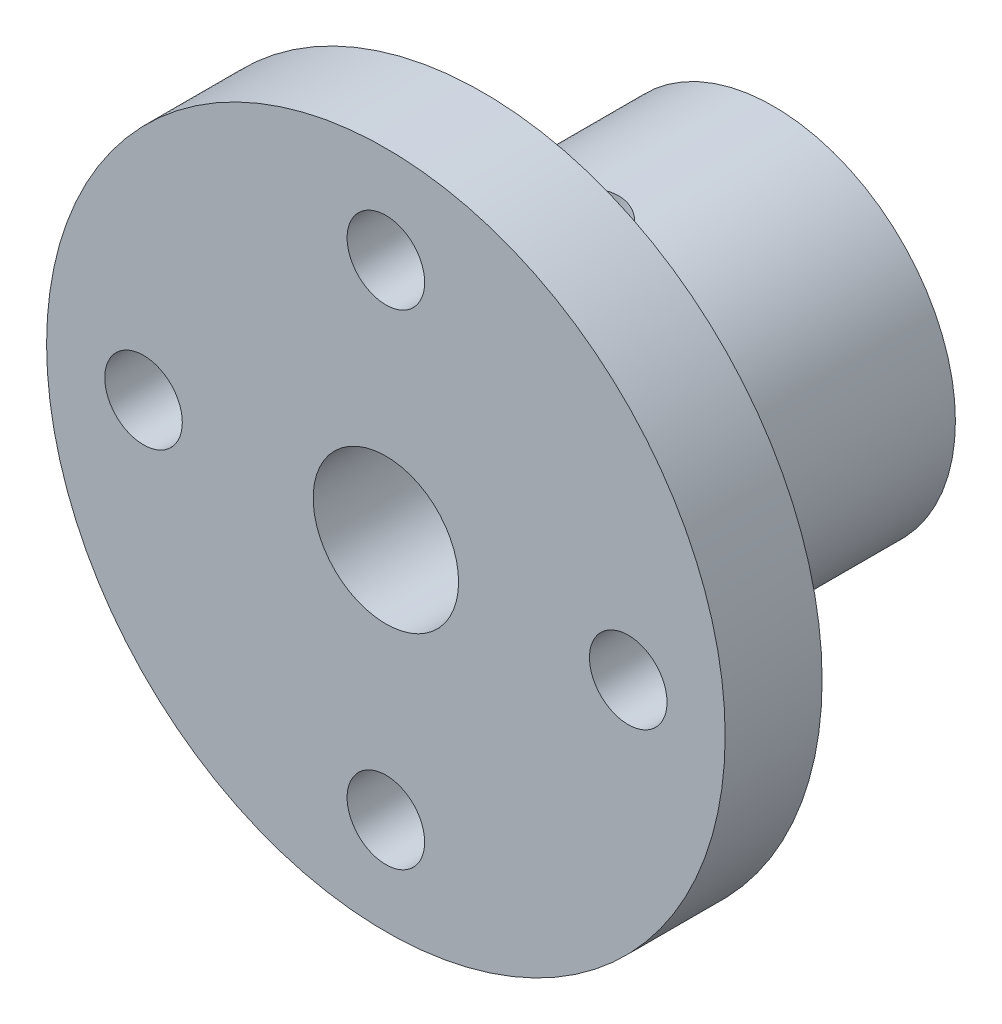
ISO-10303-21;
HEADER;
FILE_DESCRIPTION(('STEP AP214'),'2;1');
FILE_NAME('part.step','',(''),(''),'','','');
FILE_SCHEMA(('AUTOMOTIVE_DESIGN { 1 0 10303 214 1 1 1 1 }'));
ENDSEC;
DATA;
#1=APPLICATION_CONTEXT('core data for automotive mechanical design processes');
#2=APPLICATION_PROTOCOL_DEFINITION('international standard','automotive_design',2000,#1);
#3=PRODUCT_CONTEXT('',#1,'mechanical');
#4=PRODUCT('Part','Part','',(#3));
#5=PRODUCT_RELATED_PRODUCT_CATEGORY('part','',(#4));
#6=PRODUCT_DEFINITION_FORMATION('','',#4);
#7=PRODUCT_DEFINITION_CONTEXT('part definition',#1,'design');
#8=PRODUCT_DEFINITION('design','',#6,#7);
#9=PRODUCT_DEFINITION_SHAPE('','',#8);
#10=(LENGTH_UNIT() NAMED_UNIT(*) SI_UNIT(.MILLI.,.METRE.));
#11=(NAMED_UNIT(*) PLANE_ANGLE_UNIT() SI_UNIT($,.RADIAN.));
#12=(NAMED_UNIT(*) SI_UNIT($,.STERADIAN.) SOLID_ANGLE_UNIT());
#13=UNCERTAINTY_MEASURE_WITH_UNIT(LENGTH_MEASURE(1.E-05),#10,'distance_accuracy_value','');
#14=(GEOMETRIC_REPRESENTATION_CONTEXT(3) GLOBAL_UNCERTAINTY_ASSIGNED_CONTEXT((#13)) GLOBAL_UNIT_ASSIGNED_CONTEXT((#10,
#11,#12)) REPRESENTATION_CONTEXT('',''));
#15=CARTESIAN_POINT('',(0.,0.,0.));
#16=DIRECTION('',(0.,0.,1.));
#17=DIRECTION('',(1.,0.,0.));
#18=AXIS2_PLACEMENT_3D('',#15,#16,#17);
#19=CARTESIAN_POINT('',(0.,0.,-16.));
#20=DIRECTION('',(0.,0.,1.));
#21=DIRECTION('',(1.,0.,0.));
#22=AXIS2_PLACEMENT_3D('',#19,#20,#21);
#23=CYLINDRICAL_SURFACE('',#22,7.5);
#24=CARTESIAN_POINT('',(0.,7.5,-6.4));
#25=CARTESIAN_POINT('',(0.0887944293338555,7.4999983570598,-6.40000310580464));
#26=CARTESIAN_POINT('',(0.177626889700681,7.49840703800838,-6.40741663447956));
#27=CARTESIAN_POINT('',(0.352772204992273,7.49221258982039,-6.43684623857203));
#28=CARTESIAN_POINT('',(0.439083150622767,7.48760723719598,-6.45887309457672));
#29=CARTESIAN_POINT('',(0.60662858018066,7.47589793294748,-6.51681095195386));
#30=CARTESIAN_POINT('',(0.687868139445261,7.46879652810656,-6.55270780512142));
#31=CARTESIAN_POINT('',(0.843167757727071,7.45286320133509,-6.63732260760266));
#32=CARTESIAN_POINT('',(0.917228073407919,7.4440313413038,-6.68604009833691));
#33=CARTESIAN_POINT('',(1.05720419368928,7.42545480782523,-6.79570283046542));
#34=CARTESIAN_POINT('',(1.12299434543086,7.41569927510424,-6.85680663310305));
#35=CARTESIAN_POINT('',(1.24347351522622,7.39645215099328,-6.989166936086));
#36=CARTESIAN_POINT('',(1.29816158128342,7.38696058229821,-7.0604243062022));
#37=CARTESIAN_POINT('',(1.39543277767187,7.36920930951561,-7.21199059505989));
#38=CARTESIAN_POINT('',(1.43788322502763,7.36096353805546,-7.29238644331646));
#39=CARTESIAN_POINT('',(1.50862340101052,7.34679287525929,-7.45937531689855));
#40=CARTESIAN_POINT('',(1.53691473453874,7.34086772090353,-7.54596763859659));
#41=CARTESIAN_POINT('',(1.5781204953587,7.33211955105285,-7.72153161911032));
#42=CARTESIAN_POINT('',(1.59125680705956,7.32925182047022,-7.81044892540795));
#43=CARTESIAN_POINT('',(1.60246934089929,7.32680881403605,-7.98926804415069));
#44=CARTESIAN_POINT('',(1.60054732105774,7.32723315384412,-8.07916974044716));
#45=CARTESIAN_POINT('',(1.58187655808685,7.33128581769295,-8.25576395551687));
#46=CARTESIAN_POINT('',(1.56538455643806,7.33485865843677,-8.3424850841123));
#47=CARTESIAN_POINT('',(1.51844828834832,7.34471814062502,-8.51190065169833));
#48=CARTESIAN_POINT('',(1.48800327344863,7.35100492764819,-8.59459487441691));
#49=CARTESIAN_POINT('',(1.41378668233803,7.36563922179753,-8.75433637344018));
#50=CARTESIAN_POINT('',(1.36991548636568,7.37400204199821,-8.8313359047914));
#51=CARTESIAN_POINT('',(1.27016199217251,7.39183660364213,-8.97697571322876));
#52=CARTESIAN_POINT('',(1.21427813244002,7.40130848917848,-9.04561490174509));
#53=CARTESIAN_POINT('',(1.09072196751541,7.4205326849195,-9.17406475391846));
#54=CARTESIAN_POINT('',(1.02283110172082,7.43028675890513,-9.23366511786382));
#55=CARTESIAN_POINT('',(0.877908758701803,7.44879883076769,-9.34066741368745));
#56=CARTESIAN_POINT('',(0.800877131200498,7.45755681226393,-9.38806914497592));
#57=CARTESIAN_POINT('',(0.639610081827262,7.4731161994162,-9.46937667500744));
#58=CARTESIAN_POINT('',(0.555360898326548,7.47991375438739,-9.50325596228198));
#59=CARTESIAN_POINT('',(0.382188547319413,7.49075760800742,-9.55631934120427));
#60=CARTESIAN_POINT('',(0.293266027489785,7.49480428682212,-9.57550546346589));
#61=CARTESIAN_POINT('',(0.115076046551737,7.49963667143352,-9.59833443018385));
#62=CARTESIAN_POINT('',(0.0258469966592105,7.50048267119555,-9.60226469968599));
#63=CARTESIAN_POINT('',(-0.151992686527999,7.49898689492793,-9.5952479687875));
#64=CARTESIAN_POINT('',(-0.240603359252846,7.49664532405204,-9.58430192583435));
#65=CARTESIAN_POINT('',(-0.413746062380252,7.48907546339841,-9.54808177478367));
#66=CARTESIAN_POINT('',(-0.4983108633353,7.48387736587364,-9.52295745147483));
#67=CARTESIAN_POINT('',(-0.662026395792983,7.47117587533623,-9.45925941611984));
#68=CARTESIAN_POINT('',(-0.741176681186478,7.46367229265062,-9.4206845974621));
#69=CARTESIAN_POINT('',(-0.893011950773004,7.44704294085318,-9.33057492538175));
#70=CARTESIAN_POINT('',(-0.96559365973848,7.43789638159133,-9.27886997348518));
#71=CARTESIAN_POINT('',(-1.10115356003048,7.41903990869546,-9.16419284396975));
#72=CARTESIAN_POINT('',(-1.16413056725132,7.40932992580373,-9.1012192791882));
#73=CARTESIAN_POINT('',(-1.27982177561402,7.39023419815026,-8.96447656037231));
#74=CARTESIAN_POINT('',(-1.33233743532724,7.38085708289827,-8.89053800659191));
#75=CARTESIAN_POINT('',(-1.42420609305472,7.36368318738415,-8.73472128848835));
#76=CARTESIAN_POINT('',(-1.46355965021716,7.35588633999514,-8.65284346162946));
#77=CARTESIAN_POINT('',(-1.52772807228231,7.3428278116798,-8.4839054249434));
#78=CARTESIAN_POINT('',(-1.55262307368944,7.33755218632522,-8.39687678422949));
#79=CARTESIAN_POINT('',(-1.58740514879098,7.33010689029808,-8.21974527412033));
#80=CARTESIAN_POINT('',(-1.59729448874882,7.32793675061545,-8.12964287104898));
#81=CARTESIAN_POINT('',(-1.60169174862619,7.32697666157729,-7.95092074272306));
#82=CARTESIAN_POINT('',(-1.59651412882043,7.32811760571581,-7.86230897944379));
#83=CARTESIAN_POINT('',(-1.57162478005708,7.33349539816058,-7.68725139744787));
#84=CARTESIAN_POINT('',(-1.55191320540032,7.33773221359929,-7.60080555574663));
#85=CARTESIAN_POINT('',(-1.49866402761734,7.34879149338567,-7.4327687553766));
#86=CARTESIAN_POINT('',(-1.46517005919756,7.35560579203591,-7.35116339646566));
#87=CARTESIAN_POINT('',(-1.38534516691845,7.37105584436333,-7.19468291630875));
#88=CARTESIAN_POINT('',(-1.33901298148492,7.37969177702726,-7.1198084574469));
#89=CARTESIAN_POINT('',(-1.23377464987916,7.39801997202294,-6.97736032255051));
#90=CARTESIAN_POINT('',(-1.17464349733653,7.40772937703983,-6.90995505174662));
#91=CARTESIAN_POINT('',(-1.0459443480745,7.42699305436863,-6.78592046785692));
#92=CARTESIAN_POINT('',(-0.976373947694454,7.43654729038956,-6.72929364336272));
#93=CARTESIAN_POINT('',(-0.827748193968452,7.4545622712928,-6.62776396054319));
#94=CARTESIAN_POINT('',(-0.748587403501144,7.46300824065792,-6.58301269010891));
#95=CARTESIAN_POINT('',(-0.583706040029167,7.47770774713458,-6.50752100144343));
#96=CARTESIAN_POINT('',(-0.497991165498193,7.48396316300769,-6.47676857007093));
#97=CARTESIAN_POINT('',(-0.34346476310391,7.49243099511991,-6.43577023708618));
#98=CARTESIAN_POINT('',(-0.275502835649662,7.4952520823403,-6.42238148534867));
#99=CARTESIAN_POINT('',(-0.138368271279889,7.49903718747764,-6.4044953360015));
#100=CARTESIAN_POINT('',(-0.0691956833185953,7.5000012803097,-6.39999757970994));
#101=CARTESIAN_POINT('',(0.,7.5,-6.4));
#102=B_SPLINE_CURVE_WITH_KNOTS('',3,(#24,#25,#26,#27,#28,#29,#30,#31,#32,#33,#34,#35,#36,#37,
#38,#39,#40,#41,#42,#43,#44,#45,#46,#47,#48,#49,#50,#51,#52,#53,#54,#55,#56,#57,#58,#59,#60,#61,
#62,#63,#64,#65,#66,#67,#68,#69,#70,#71,#72,#73,#74,#75,#76,#77,#78,#79,#80,#81,#82,#83,#84,#85,
#86,#87,#88,#89,#90,#91,#92,#93,#94,#95,#96,#97,#98,#99,#100,#101),.UNSPECIFIED.,.T.,.F.,(4,2,2,
2,2,2,2,2,2,2,2,2,2,2,2,2,2,2,2,2,2,2,2,2,2,2,2,2,2,2,2,2,2,2,2,2,2,2,4),(0.,0.266130047854763,
0.532456644597193,0.798512286868045,1.0645584139285,1.33425388789939,1.60397247832158,
1.87651399120587,2.14902460517277,2.41749263134366,2.68592931506412,2.94972810159234,
3.21354104030559,3.47936093436643,3.74521540295248,4.01653060252532,4.28785026321978,
4.55969927797482,4.83151071607125,5.09817555204362,5.36482322613615,5.62870529395038,
5.89260907723843,6.16012360036749,6.42767107713311,6.69989324302713,6.97210384299803,
7.24279095265699,7.51343717712195,7.77847555890145,8.04351112692155,8.30771397733335,
8.57194279940304,8.84126112654219,9.11064156026671,9.38331104903345,9.65574610257701,
9.86314417471904,10.0705338798061),.UNSPECIFIED.);
#103=CARTESIAN_POINT('',(0.,7.5,-6.4));
#104=VERTEX_POINT('',#103);
#105=EDGE_CURVE('E103',#104,#104,#102,.T.);
#106=ORIENTED_EDGE('',*,*,#105,.F.);
#107=EDGE_LOOP('',(#106));
#108=FACE_BOUND('',#107,.T.);
#109=CARTESIAN_POINT('',(0.,0.,-16.));
#110=DIRECTION('',(0.,0.,1.));
#111=DIRECTION('',(1.,0.,0.));
#112=AXIS2_PLACEMENT_3D('',#109,#110,#111);
#113=CIRCLE('',#112,7.5);
#114=CARTESIAN_POINT('',(7.5,0.,-16.));
#115=VERTEX_POINT('',#114);
#116=EDGE_CURVE('E10',#115,#115,#113,.T.);
#117=ORIENTED_EDGE('',*,*,#116,.T.);
#118=EDGE_LOOP('',(#117));
#119=FACE_BOUND('',#118,.T.);
#120=CARTESIAN_POINT('',(0.,0.,-4.));
#121=DIRECTION('',(0.,0.,1.));
#122=DIRECTION('',(1.,0.,0.));
#123=AXIS2_PLACEMENT_3D('',#120,#121,#122);
#124=CIRCLE('',#123,7.5);
#125=CARTESIAN_POINT('',(7.5,0.,-4.));
#126=VERTEX_POINT('',#125);
#127=EDGE_CURVE('E51',#126,#126,#124,.F.);
#128=ORIENTED_EDGE('',*,*,#127,.T.);
#129=EDGE_LOOP('',(#128));
#130=FACE_BOUND('',#129,.T.);
#131=ADVANCED_FACE('F37',(#108,#119,#130),#23,.T.);
#132=CARTESIAN_POINT('',(0.,0.,-16.));
#133=DIRECTION('',(0.,0.,1.));
#134=DIRECTION('',(1.,0.,0.));
#135=AXIS2_PLACEMENT_3D('',#132,#133,#134);
#136=PLANE('',#135);
#137=CARTESIAN_POINT('',(0.,0.,-16.));
#138=DIRECTION('',(0.,0.,1.));
#139=DIRECTION('',(1.,0.,0.));
#140=AXIS2_PLACEMENT_3D('',#137,#138,#139);
#141=CIRCLE('',#140,3.);
#142=CARTESIAN_POINT('',(3.,0.,-16.));
#143=VERTEX_POINT('',#142);
#144=EDGE_CURVE('E82',#143,#143,#141,.T.);
#145=ORIENTED_EDGE('',*,*,#144,.T.);
#146=EDGE_LOOP('',(#145));
#147=FACE_BOUND('',#146,.T.);
#148=ORIENTED_EDGE('',*,*,#116,.F.);
#149=EDGE_LOOP('',(#148));
#150=FACE_BOUND('',#149,.T.);
#151=ADVANCED_FACE('F146',(#147,#150),#136,.F.);
#152=CARTESIAN_POINT('',(0.,0.,-4.));
#153=DIRECTION('',(0.,0.,1.));
#154=DIRECTION('',(1.,0.,0.));
#155=AXIS2_PLACEMENT_3D('',#152,#153,#154);
#156=CYLINDRICAL_SURFACE('',#155,14.);
#157=CARTESIAN_POINT('',(0.,0.,-4.));
#158=DIRECTION('',(0.,0.,1.));
#159=DIRECTION('',(1.,0.,0.));
#160=AXIS2_PLACEMENT_3D('',#157,#158,#159);
#161=CIRCLE('',#160,14.);
#162=CARTESIAN_POINT('',(14.,0.,-4.));
#163=VERTEX_POINT('',#162);
#164=EDGE_CURVE('E57',#163,#163,#161,.T.);
#165=ORIENTED_EDGE('',*,*,#164,.T.);
#166=EDGE_LOOP('',(#165));
#167=FACE_BOUND('',#166,.T.);
#168=CARTESIAN_POINT('',(0.,0.,0.));
#169=DIRECTION('',(0.,0.,1.));
#170=DIRECTION('',(1.,0.,0.));
#171=AXIS2_PLACEMENT_3D('',#168,#169,#170);
#172=CIRCLE('',#171,14.);
#173=CARTESIAN_POINT('',(14.,0.,0.));
#174=VERTEX_POINT('',#173);
#175=EDGE_CURVE('E59',#174,#174,#172,.T.);
#176=ORIENTED_EDGE('',*,*,#175,.F.);
#177=EDGE_LOOP('',(#176));
#178=FACE_BOUND('',#177,.T.);
#179=ADVANCED_FACE('F142',(#167,#178),#156,.T.);
#180=CARTESIAN_POINT('',(0.,0.,-4.));
#181=DIRECTION('',(0.,0.,1.));
#182=DIRECTION('',(1.,0.,0.));
#183=AXIS2_PLACEMENT_3D('',#180,#181,#182);
#184=PLANE('',#183);
#185=CARTESIAN_POINT('',(10.,0.,-4.));
#186=DIRECTION('',(0.,0.,1.));
#187=DIRECTION('',(1.,0.,0.));
#188=AXIS2_PLACEMENT_3D('',#185,#186,#187);
#189=CIRCLE('',#188,1.6);
#190=CARTESIAN_POINT('',(11.6,0.,-4.));
#191=VERTEX_POINT('',#190);
#192=EDGE_CURVE('E63',#191,#191,#189,.T.);
#193=ORIENTED_EDGE('',*,*,#192,.T.);
#194=EDGE_LOOP('',(#193));
#195=FACE_BOUND('',#194,.T.);
#196=CARTESIAN_POINT('',(0.,-10.,-4.));
#197=DIRECTION('',(0.,0.,1.));
#198=DIRECTION('',(1.,0.,0.));
#199=AXIS2_PLACEMENT_3D('',#196,#197,#198);
#200=CIRCLE('',#199,1.6);
#201=CARTESIAN_POINT('',(1.59999999999997,-10.,-4.));
#202=VERTEX_POINT('',#201);
#203=EDGE_CURVE('E70',#202,#202,#200,.T.);
#204=ORIENTED_EDGE('',*,*,#203,.T.);
#205=EDGE_LOOP('',(#204));
#206=FACE_BOUND('',#205,.T.);
#207=CARTESIAN_POINT('',(-10.,0.,-4.));
#208=DIRECTION('',(0.,0.,1.));
#209=DIRECTION('',(1.,0.,0.));
#210=AXIS2_PLACEMENT_3D('',#207,#208,#209);
#211=CIRCLE('',#210,1.6);
#212=CARTESIAN_POINT('',(-8.4,0.,-4.));
#213=VERTEX_POINT('',#212);
#214=EDGE_CURVE('E74',#213,#213,#211,.T.);
#215=ORIENTED_EDGE('',*,*,#214,.T.);
#216=EDGE_LOOP('',(#215));
#217=FACE_BOUND('',#216,.T.);
#218=CARTESIAN_POINT('',(1.04744440165294E-13,10.,-4.));
#219=DIRECTION('',(0.,0.,1.));
#220=DIRECTION('',(1.,0.,0.));
#221=AXIS2_PLACEMENT_3D('',#218,#219,#220);
#222=CIRCLE('',#221,1.6);
#223=CARTESIAN_POINT('',(1.60000000000011,10.,-4.));
#224=VERTEX_POINT('',#223);
#225=EDGE_CURVE('E78',#224,#224,#222,.T.);
#226=ORIENTED_EDGE('',*,*,#225,.T.);
#227=EDGE_LOOP('',(#226));
#228=FACE_BOUND('',#227,.T.);
#229=ORIENTED_EDGE('',*,*,#127,.F.);
#230=EDGE_LOOP('',(#229));
#231=FACE_BOUND('',#230,.T.);
#232=ORIENTED_EDGE('',*,*,#164,.F.);
#233=EDGE_LOOP('',(#232));
#234=FACE_BOUND('',#233,.T.);
#235=ADVANCED_FACE('F139',(#195,#206,#217,#228,#231,#234),#184,.F.);
#236=CARTESIAN_POINT('',(0.,0.,0.));
#237=DIRECTION('',(0.,0.,1.));
#238=DIRECTION('',(1.,0.,0.));
#239=AXIS2_PLACEMENT_3D('',#236,#237,#238);
#240=PLANE('',#239);
#241=CARTESIAN_POINT('',(10.,0.,0.));
#242=DIRECTION('',(0.,0.,1.));
#243=DIRECTION('',(1.,0.,0.));
#244=AXIS2_PLACEMENT_3D('',#241,#242,#243);
#245=CIRCLE('',#244,1.6);
#246=CARTESIAN_POINT('',(11.6,0.,0.));
#247=VERTEX_POINT('',#246);
#248=EDGE_CURVE('E87',#247,#247,#245,.T.);
#249=ORIENTED_EDGE('',*,*,#248,.F.);
#250=EDGE_LOOP('',(#249));
#251=FACE_BOUND('',#250,.T.);
#252=CARTESIAN_POINT('',(0.,-10.,0.));
#253=DIRECTION('',(0.,0.,1.));
#254=DIRECTION('',(1.,0.,0.));
#255=AXIS2_PLACEMENT_3D('',#252,#253,#254);
#256=CIRCLE('',#255,1.6);
#257=CARTESIAN_POINT('',(1.59999999999997,-10.,0.));
#258=VERTEX_POINT('',#257);
#259=EDGE_CURVE('E91',#258,#258,#256,.T.);
#260=ORIENTED_EDGE('',*,*,#259,.F.);
#261=EDGE_LOOP('',(#260));
#262=FACE_BOUND('',#261,.T.);
#263=CARTESIAN_POINT('',(-10.,0.,0.));
#264=DIRECTION('',(0.,0.,1.));
#265=DIRECTION('',(1.,0.,0.));
#266=AXIS2_PLACEMENT_3D('',#263,#264,#265);
#267=CIRCLE('',#266,1.6);
#268=CARTESIAN_POINT('',(-8.4,0.,0.));
#269=VERTEX_POINT('',#268);
#270=EDGE_CURVE('E95',#269,#269,#267,.T.);
#271=ORIENTED_EDGE('',*,*,#270,.F.);
#272=EDGE_LOOP('',(#271));
#273=FACE_BOUND('',#272,.T.);
#274=CARTESIAN_POINT('',(1.04744440165294E-13,10.,0.));
#275=DIRECTION('',(0.,0.,1.));
#276=DIRECTION('',(1.,0.,0.));
#277=AXIS2_PLACEMENT_3D('',#274,#275,#276);
#278=CIRCLE('',#277,1.6);
#279=CARTESIAN_POINT('',(1.60000000000011,10.,0.));
#280=VERTEX_POINT('',#279);
#281=EDGE_CURVE('E99',#280,#280,#278,.T.);
#282=ORIENTED_EDGE('',*,*,#281,.F.);
#283=EDGE_LOOP('',(#282));
#284=FACE_BOUND('',#283,.T.);
#285=CARTESIAN_POINT('',(0.,0.,0.));
#286=DIRECTION('',(0.,0.,1.));
#287=DIRECTION('',(1.,0.,0.));
#288=AXIS2_PLACEMENT_3D('',#285,#286,#287);
#289=CIRCLE('',#288,3.);
#290=CARTESIAN_POINT('',(3.,0.,0.));
#291=VERTEX_POINT('',#290);
#292=EDGE_CURVE('E83',#291,#291,#289,.T.);
#293=ORIENTED_EDGE('',*,*,#292,.F.);
#294=EDGE_LOOP('',(#293));
#295=FACE_BOUND('',#294,.T.);
#296=ORIENTED_EDGE('',*,*,#175,.T.);
#297=EDGE_LOOP('',(#296));
#298=FACE_BOUND('',#297,.T.);
#299=ADVANCED_FACE('F137',(#251,#262,#273,#284,#295,#298),#240,.T.);
#300=CARTESIAN_POINT('',(0.,0.,-16.));
#301=DIRECTION('',(0.,0.,1.));
#302=DIRECTION('',(1.,0.,0.));
#303=AXIS2_PLACEMENT_3D('',#300,#301,#302);
#304=CYLINDRICAL_SURFACE('',#303,3.);
#305=CARTESIAN_POINT('',(0.,3.,-6.4));
#306=CARTESIAN_POINT('',(0.0834280085828026,2.99999516830785,-6.40000541657417));
#307=CARTESIAN_POINT('',(0.166934582506535,2.99648378720922,-6.40656319282337));
#308=CARTESIAN_POINT('',(0.331436394670318,2.98278259335468,-6.4324834017336));
#309=CARTESIAN_POINT('',(0.412427539682874,2.97258243738723,-6.45186566600765));
#310=CARTESIAN_POINT('',(0.569277189891047,2.94656073601314,-6.502439679716));
#311=CARTESIAN_POINT('',(0.645155024474137,2.93076195982554,-6.53358362837878));
#312=CARTESIAN_POINT('',(0.790470948459431,2.89495499745187,-6.60652510342497));
#313=CARTESIAN_POINT('',(0.859909008635982,2.87494679216347,-6.64832267815454));
#314=CARTESIAN_POINT('',(0.995534638915594,2.83095801330151,-6.74450312345995));
#315=CARTESIAN_POINT('',(1.06120405491229,2.80680229614067,-6.79953520702592));
#316=CARTESIAN_POINT('',(1.18286806133739,2.75774084341935,-6.91920629138709));
#317=CARTESIAN_POINT('',(1.23885417984542,2.73283447325624,-6.98385361351812));
#318=CARTESIAN_POINT('',(1.34470883896841,2.68244281334124,-7.12795611690511));
#319=CARTESIAN_POINT('',(1.39355367383636,2.65711191284795,-7.20822409712112));
#320=CARTESIAN_POINT('',(1.47685283241531,2.6117367722112,-7.37729136249292));
#321=CARTESIAN_POINT('',(1.51131827632936,2.59168845125878,-7.46608398955431));
#322=CARTESIAN_POINT('',(1.56248710339327,2.56114789725882,-7.64410853876906));
#323=CARTESIAN_POINT('',(1.58016623486331,2.55013659138239,-7.7329659441932));
#324=CARTESIAN_POINT('',(1.60018994479719,2.53762662306211,-7.91300774391914));
#325=CARTESIAN_POINT('',(1.60255389391569,2.53611594428853,-8.00418905226539));
#326=CARTESIAN_POINT('',(1.59259204330144,2.54237297611912,-8.17244373129593));
#327=CARTESIAN_POINT('',(1.5822864459542,2.54886502713221,-8.24969689324517));
#328=CARTESIAN_POINT('',(1.55082691014658,2.56812634563423,-8.4011492478833));
#329=CARTESIAN_POINT('',(1.52966860751486,2.58089813829439,-8.47534719901127));
#330=CARTESIAN_POINT('',(1.47678050478154,2.6115255571428,-8.62067605314732));
#331=CARTESIAN_POINT('',(1.44482388986181,2.62948894800927,-8.69170060617008));
#332=CARTESIAN_POINT('',(1.37143304593392,2.66850094165746,-8.82773905271474));
#333=CARTESIAN_POINT('',(1.32999461708737,2.68955091010761,-8.89275026473803));
#334=CARTESIAN_POINT('',(1.23173704487371,2.73609049880501,-9.02497172242656));
#335=CARTESIAN_POINT('',(1.17355258231979,2.76177798986485,-9.09110147049342));
#336=CARTESIAN_POINT('',(1.0469027467487,2.81223117246244,-9.21315071537989));
#337=CARTESIAN_POINT('',(0.978431146098925,2.83699629420455,-9.26906398158625));
#338=CARTESIAN_POINT('',(0.828044154062364,2.88460021999068,-9.37227542982841));
#339=CARTESIAN_POINT('',(0.745570968821584,2.90723646176344,-9.41886221638782));
#340=CARTESIAN_POINT('',(0.57245371947229,2.9462079060851,-9.4970957663538));
#341=CARTESIAN_POINT('',(0.481817034499117,2.96254873003402,-9.52875586400623));
#342=CARTESIAN_POINT('',(0.303664427911811,2.9858199122846,-9.57335522481456));
#343=CARTESIAN_POINT('',(0.216600262764063,2.99346409984954,-9.58772140261997));
#344=CARTESIAN_POINT('',(0.0409791950824074,3.00100442054404,-9.60189500640087));
#345=CARTESIAN_POINT('',(-0.0475768145688006,3.00090503432182,-9.60171085160458));
#346=CARTESIAN_POINT('',(-0.215091919521214,2.99334764517664,-9.58750014233865));
#347=CARTESIAN_POINT('',(-0.294192898535463,2.98655794488573,-9.57473071850348));
#348=CARTESIAN_POINT('',(-0.448939109663163,2.96724376655693,-9.53778511580417));
#349=CARTESIAN_POINT('',(-0.524583981374493,2.95471869192973,-9.51360775028661));
#350=CARTESIAN_POINT('',(-0.672500335044404,2.92465141623378,-9.45405011506355));
#351=CARTESIAN_POINT('',(-0.744640666753738,2.9069918992478,-9.41840553016343));
#352=CARTESIAN_POINT('',(-0.882124314821923,2.86826876163522,-9.3372496913968));
#353=CARTESIAN_POINT('',(-0.94746496400545,2.84720381343929,-9.29173458724621));
#354=CARTESIAN_POINT('',(-1.07697928921282,2.80095291390707,-9.18651039778454));
#355=CARTESIAN_POINT('',(-1.1402697302165,2.77556745933858,-9.12580066534228));
#356=CARTESIAN_POINT('',(-1.25621972548301,2.72505417098626,-8.99477432816969));
#357=CARTESIAN_POINT('',(-1.30886943094942,2.69992659611925,-8.92444892341591));
#358=CARTESIAN_POINT('',(-1.40548153261782,2.65099028655931,-8.77034702764994));
#359=CARTESIAN_POINT('',(-1.44862048937835,2.62738421458254,-8.68598372244117));
#360=CARTESIAN_POINT('',(-1.51964969635315,2.58695870125936,-8.50957981982766));
#361=CARTESIAN_POINT('',(-1.54756166073897,2.57012960475316,-8.41755037175651));
#362=CARTESIAN_POINT('',(-1.5845909036139,2.54745026922036,-8.23797230580492));
#363=CARTESIAN_POINT('',(-1.59528122309048,2.54068617365327,-8.15086763256909));
#364=CARTESIAN_POINT('',(-1.60220766902338,2.53632719775287,-7.97587937163927));
#365=CARTESIAN_POINT('',(-1.59845364948012,2.53872606639137,-7.88799635575484));
#366=CARTESIAN_POINT('',(-1.57811270148832,2.55140495355656,-7.72530729028392));
#367=CARTESIAN_POINT('',(-1.56314118274069,2.5606915110498,-7.65021021854508));
#368=CARTESIAN_POINT('',(-1.52298687295876,2.58477383442181,-7.50373208491777));
#369=CARTESIAN_POINT('',(-1.4978002949924,2.59957164326813,-7.43235241223123));
#370=CARTESIAN_POINT('',(-1.43616070422438,2.63415331148715,-7.29019044090726));
#371=CARTESIAN_POINT('',(-1.3990864148575,2.65419696823125,-7.21974286516991));
#372=CARTESIAN_POINT('',(-1.31534245335434,2.6966792141344,-7.08559612847905));
#373=CARTESIAN_POINT('',(-1.26866761463333,2.71911908969112,-7.02190062927588));
#374=CARTESIAN_POINT('',(-1.15916720525938,2.76774539611286,-6.8934538122456));
#375=CARTESIAN_POINT('',(-1.09498203667427,2.79400424140764,-6.82988251912699));
#376=CARTESIAN_POINT('',(-0.956300329149748,2.8444566012759,-6.71405545919915));
#377=CARTESIAN_POINT('',(-0.881797165766557,2.86864877272258,-6.66180701769989));
#378=CARTESIAN_POINT('',(-0.722044005153543,2.91302030182076,-6.56913208023582));
#379=CARTESIAN_POINT('',(-0.636577331123641,2.93308821046928,-6.52902274753253));
#380=CARTESIAN_POINT('',(-0.458798662878498,2.9660771301132,-6.46429275489003));
#381=CARTESIAN_POINT('',(-0.366505693768792,2.97901721406285,-6.4396307358165));
#382=CARTESIAN_POINT('',(-0.227615355842193,2.99169552229494,-6.41561465742407));
#383=CARTESIAN_POINT('',(-0.182355494246518,2.9947988863485,-6.40977023158805));
#384=CARTESIAN_POINT('',(-0.0914049548856032,2.9989524612278,-6.40196139569163));
#385=CARTESIAN_POINT('',(-0.0457142719789323,3.00000264751962,-6.39999703199502));
#386=CARTESIAN_POINT('',(0.,3.,-6.4));
#387=B_SPLINE_CURVE_WITH_KNOTS('',3,(#305,#306,#307,#308,#309,#310,#311,#312,#313,#314,#315,
#316,#317,#318,#319,#320,#321,#322,#323,#324,#325,#326,#327,#328,#329,#330,#331,#332,#333,#334,
#335,#336,#337,#338,#339,#340,#341,#342,#343,#344,#345,#346,#347,#348,#349,#350,#351,#352,#353,
#354,#355,#356,#357,#358,#359,#360,#361,#362,#363,#364,#365,#366,#367,#368,#369,#370,#371,#372,
#373,#374,#375,#376,#377,#378,#379,#380,#381,#382,#383,#384,#385,#386),.UNSPECIFIED.,.T.,.F.,(4,
2,2,2,2,2,2,2,2,2,2,2,2,2,2,2,2,2,2,2,2,2,2,2,2,2,2,2,2,2,2,2,2,2,2,2,2,2,2,2,4),(0.,
0.250099571937984,0.500586801159414,0.750066790862757,0.999547912726741,1.26551787503545,
1.53171937023862,1.82220042181316,2.11245641359362,2.3845660085837,2.65633137184324,
2.88985639109234,3.12347539088301,3.3623427439711,3.60131610556615,3.87540340557937,
4.14965730631696,4.44024459698544,4.7305718072894,4.99480330643343,5.2588819149833,
5.49900649956853,5.73915606740715,5.98529384057671,6.2315278002262,6.50427545175262,
6.77727440700572,7.06865169074469,7.3596123678454,7.62207574902766,7.88436010813391,
8.1147617764152,8.34524893751089,8.59058452776186,8.83605249367797,9.11702751803745,
9.39818377987291,9.68615329689658,9.9733484617649,10.110388568954,10.2474303136582),.UNSPECIFIED.);
#388=CARTESIAN_POINT('',(0.,3.,-6.4));
#389=VERTEX_POINT('',#388);
#390=EDGE_CURVE('E41',#389,#389,#387,.T.);
#391=ORIENTED_EDGE('',*,*,#390,.T.);
#392=EDGE_LOOP('',(#391));
#393=FACE_BOUND('',#392,.T.);
#394=ORIENTED_EDGE('',*,*,#144,.F.);
#395=EDGE_LOOP('',(#394));
#396=FACE_BOUND('',#395,.T.);
#397=ORIENTED_EDGE('',*,*,#292,.T.);
#398=EDGE_LOOP('',(#397));
#399=FACE_BOUND('',#398,.T.);
#400=ADVANCED_FACE('F127',(#393,#396,#399),#304,.F.);
#401=CARTESIAN_POINT('',(1.04744440165294E-13,10.,-16.));
#402=DIRECTION('',(0.,0.,1.));
#403=DIRECTION('',(1.,0.,0.));
#404=AXIS2_PLACEMENT_3D('',#401,#402,#403);
#405=CYLINDRICAL_SURFACE('',#404,1.6);
#406=ORIENTED_EDGE('',*,*,#281,.T.);
#407=EDGE_LOOP('',(#406));
#408=FACE_BOUND('',#407,.T.);
#409=ORIENTED_EDGE('',*,*,#225,.F.);
#410=EDGE_LOOP('',(#409));
#411=FACE_BOUND('',#410,.T.);
#412=ADVANCED_FACE('F123',(#408,#411),#405,.F.);
#413=CARTESIAN_POINT('',(-10.,0.,-16.));
#414=DIRECTION('',(0.,0.,1.));
#415=DIRECTION('',(1.,0.,0.));
#416=AXIS2_PLACEMENT_3D('',#413,#414,#415);
#417=CYLINDRICAL_SURFACE('',#416,1.6);
#418=ORIENTED_EDGE('',*,*,#270,.T.);
#419=EDGE_LOOP('',(#418));
#420=FACE_BOUND('',#419,.T.);
#421=ORIENTED_EDGE('',*,*,#214,.F.);
#422=EDGE_LOOP('',(#421));
#423=FACE_BOUND('',#422,.T.);
#424=ADVANCED_FACE('F118',(#420,#423),#417,.F.);
#425=CARTESIAN_POINT('',(0.,-10.,-16.));
#426=DIRECTION('',(0.,0.,1.));
#427=DIRECTION('',(1.,0.,0.));
#428=AXIS2_PLACEMENT_3D('',#425,#426,#427);
#429=CYLINDRICAL_SURFACE('',#428,1.6);
#430=ORIENTED_EDGE('',*,*,#259,.T.);
#431=EDGE_LOOP('',(#430));
#432=FACE_BOUND('',#431,.T.);
#433=ORIENTED_EDGE('',*,*,#203,.F.);
#434=EDGE_LOOP('',(#433));
#435=FACE_BOUND('',#434,.T.);
#436=ADVANCED_FACE('F122',(#432,#435),#429,.F.);
#437=CARTESIAN_POINT('',(10.,0.,-16.));
#438=DIRECTION('',(0.,0.,1.));
#439=DIRECTION('',(1.,0.,0.));
#440=AXIS2_PLACEMENT_3D('',#437,#438,#439);
#441=CYLINDRICAL_SURFACE('',#440,1.6);
#442=ORIENTED_EDGE('',*,*,#248,.T.);
#443=EDGE_LOOP('',(#442));
#444=FACE_BOUND('',#443,.T.);
#445=ORIENTED_EDGE('',*,*,#192,.F.);
#446=EDGE_LOOP('',(#445));
#447=FACE_BOUND('',#446,.T.);
#448=ADVANCED_FACE('F116',(#444,#447),#441,.F.);
#449=CARTESIAN_POINT('',(0.,0.,-8.));
#450=DIRECTION('',(0.,1.,0.));
#451=DIRECTION('',(0.,0.,1.));
#452=AXIS2_PLACEMENT_3D('',#449,#450,#451);
#453=CYLINDRICAL_SURFACE('',#452,1.6);
#454=ORIENTED_EDGE('',*,*,#105,.T.);
#455=EDGE_LOOP('',(#454));
#456=FACE_BOUND('',#455,.T.);
#457=ORIENTED_EDGE('',*,*,#390,.F.);
#458=EDGE_LOOP('',(#457));
#459=FACE_BOUND('',#458,.T.);
#460=ADVANCED_FACE('F112',(#456,#459),#453,.F.);
#461=CLOSED_SHELL('',(#131,#151,#179,#235,#299,#400,#412,#424,#436,#448,#460));
#462=MANIFOLD_SOLID_BREP('B2',#461);
#463=ADVANCED_BREP_SHAPE_REPRESENTATION('',(#18,#462),#14);
#464=SHAPE_DEFINITION_REPRESENTATION(#9,#463);
ENDSEC;
END-ISO-10303-21;
